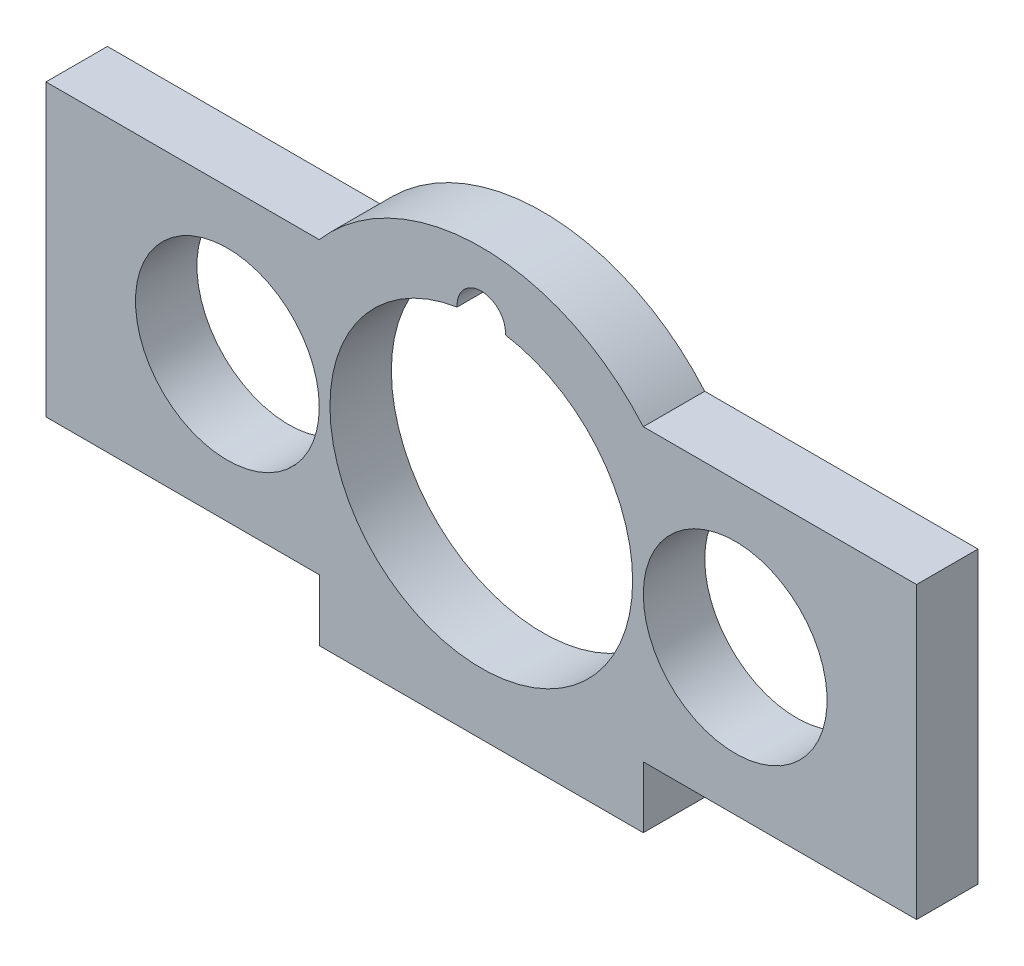
ISO-10303-21;
HEADER;
FILE_DESCRIPTION(('STEP AP214'),'2;1');
FILE_NAME('part.step','',(''),(''),'','','');
FILE_SCHEMA(('AUTOMOTIVE_DESIGN { 1 0 10303 214 1 1 1 1 }'));
ENDSEC;
DATA;
#1=APPLICATION_CONTEXT('core data for automotive mechanical design processes');
#2=APPLICATION_PROTOCOL_DEFINITION('international standard','automotive_design',2000,#1);
#3=PRODUCT_CONTEXT('',#1,'mechanical');
#4=PRODUCT('Part','Part','',(#3));
#5=PRODUCT_RELATED_PRODUCT_CATEGORY('part','',(#4));
#6=PRODUCT_DEFINITION_FORMATION('','',#4);
#7=PRODUCT_DEFINITION_CONTEXT('part definition',#1,'design');
#8=PRODUCT_DEFINITION('design','',#6,#7);
#9=PRODUCT_DEFINITION_SHAPE('','',#8);
#10=(LENGTH_UNIT() NAMED_UNIT(*) SI_UNIT(.MILLI.,.METRE.));
#11=(NAMED_UNIT(*) PLANE_ANGLE_UNIT() SI_UNIT($,.RADIAN.));
#12=(NAMED_UNIT(*) SI_UNIT($,.STERADIAN.) SOLID_ANGLE_UNIT());
#13=UNCERTAINTY_MEASURE_WITH_UNIT(LENGTH_MEASURE(1.E-05),#10,'distance_accuracy_value','');
#14=(GEOMETRIC_REPRESENTATION_CONTEXT(3) GLOBAL_UNCERTAINTY_ASSIGNED_CONTEXT((#13)) GLOBAL_UNIT_ASSIGNED_CONTEXT((#10,
#11,#12)) REPRESENTATION_CONTEXT('',''));
#15=CARTESIAN_POINT('',(0.,0.,0.));
#16=DIRECTION('',(0.,0.,1.));
#17=DIRECTION('',(1.,0.,0.));
#18=AXIS2_PLACEMENT_3D('',#15,#16,#17);
#19=CARTESIAN_POINT('',(0.,0.,2.54));
#20=DIRECTION('',(0.,0.,1.));
#21=DIRECTION('',(1.,0.,0.));
#22=AXIS2_PLACEMENT_3D('',#19,#20,#21);
#23=PLANE('',#22);
#24=CARTESIAN_POINT('',(0.,0.,2.54));
#25=DIRECTION('',(0.,0.,1.));
#26=DIRECTION('',(-1.,0.,0.));
#27=AXIS2_PLACEMENT_3D('',#24,#25,#26);
#28=CIRCLE('',#27,6.25856555906726);
#29=CARTESIAN_POINT('',(-0.997445717412066,6.17857142857143,2.54));
#30=VERTEX_POINT('',#29);
#31=CARTESIAN_POINT('',(0.997445717412068,6.17857142857143,2.54));
#32=VERTEX_POINT('',#31);
#33=EDGE_CURVE('E118',#30,#32,#28,.T.);
#34=ORIENTED_EDGE('',*,*,#33,.F.);
#35=CARTESIAN_POINT('',(0.,6.25,2.54));
#36=DIRECTION('',(0.,0.,1.));
#37=DIRECTION('',(1.,0.,0.));
#38=AXIS2_PLACEMENT_3D('',#35,#36,#37);
#39=CIRCLE('',#38,1.);
#40=EDGE_CURVE('E124',#32,#30,#39,.T.);
#41=ORIENTED_EDGE('',*,*,#40,.F.);
#42=EDGE_LOOP('',(#34,#41));
#43=FACE_BOUND('',#42,.T.);
#44=DIRECTION('',(1.,0.,0.));
#45=VECTOR('',#44,1.);
#46=CARTESIAN_POINT('',(-18.,-6.25856555906726,2.54));
#47=LINE('',#46,#45);
#48=CARTESIAN_POINT('',(-18.,-6.25856555906726,2.54));
#49=VERTEX_POINT('',#48);
#50=CARTESIAN_POINT('',(-6.69999999999999,-6.25856555906726,2.54));
#51=VERTEX_POINT('',#50);
#52=EDGE_CURVE('E146',#49,#51,#47,.T.);
#53=ORIENTED_EDGE('',*,*,#52,.T.);
#54=DIRECTION('',(0.,-1.,0.));
#55=VECTOR('',#54,1.);
#56=CARTESIAN_POINT('',(-6.69999999999999,-6.25856555906726,2.54));
#57=LINE('',#56,#55);
#58=CARTESIAN_POINT('',(-6.69999999999999,-8.79856555906726,2.54));
#59=VERTEX_POINT('',#58);
#60=EDGE_CURVE('E149',#51,#59,#57,.T.);
#61=ORIENTED_EDGE('',*,*,#60,.T.);
#62=DIRECTION('',(1.,0.,0.));
#63=VECTOR('',#62,1.);
#64=CARTESIAN_POINT('',(-6.69999999999999,-8.79856555906726,2.54));
#65=LINE('',#64,#63);
#66=CARTESIAN_POINT('',(6.69999999999999,-8.79856555906726,2.54));
#67=VERTEX_POINT('',#66);
#68=EDGE_CURVE('E152',#59,#67,#65,.T.);
#69=ORIENTED_EDGE('',*,*,#68,.T.);
#70=DIRECTION('',(0.,1.,0.));
#71=VECTOR('',#70,1.);
#72=CARTESIAN_POINT('',(6.69999999999999,-6.25856555906726,2.54));
#73=LINE('',#72,#71);
#74=CARTESIAN_POINT('',(6.69999999999999,-6.25856555906726,2.54));
#75=VERTEX_POINT('',#74);
#76=EDGE_CURVE('E154',#67,#75,#73,.T.);
#77=ORIENTED_EDGE('',*,*,#76,.T.);
#78=DIRECTION('',(1.,0.,0.));
#79=VECTOR('',#78,1.);
#80=CARTESIAN_POINT('',(18.,-6.25856555906726,2.54));
#81=LINE('',#80,#79);
#82=CARTESIAN_POINT('',(18.,-6.25856555906726,2.54));
#83=VERTEX_POINT('',#82);
#84=EDGE_CURVE('E156',#75,#83,#81,.T.);
#85=ORIENTED_EDGE('',*,*,#84,.T.);
#86=DIRECTION('',(0.,1.,0.));
#87=VECTOR('',#86,1.);
#88=CARTESIAN_POINT('',(18.,-6.25856555906726,2.54));
#89=LINE('',#88,#87);
#90=CARTESIAN_POINT('',(18.,5.74143444093274,2.54));
#91=VERTEX_POINT('',#90);
#92=EDGE_CURVE('E158',#83,#91,#89,.T.);
#93=ORIENTED_EDGE('',*,*,#92,.T.);
#94=DIRECTION('',(-1.,0.,0.));
#95=VECTOR('',#94,1.);
#96=CARTESIAN_POINT('',(18.,5.74143444093274,2.54));
#97=LINE('',#96,#95);
#98=CARTESIAN_POINT('',(6.69999999999999,5.74143444093274,2.54));
#99=VERTEX_POINT('',#98);
#100=EDGE_CURVE('E160',#91,#99,#97,.T.);
#101=ORIENTED_EDGE('',*,*,#100,.T.);
#102=CARTESIAN_POINT('',(0.,0.,2.54));
#103=DIRECTION('',(0.,0.,1.));
#104=DIRECTION('',(1.,0.,0.));
#105=AXIS2_PLACEMENT_3D('',#102,#103,#104);
#106=CIRCLE('',#105,8.82349530738973);
#107=CARTESIAN_POINT('',(-6.69999999999999,5.74143444093274,2.54));
#108=VERTEX_POINT('',#107);
#109=EDGE_CURVE('E162',#99,#108,#106,.T.);
#110=ORIENTED_EDGE('',*,*,#109,.T.);
#111=DIRECTION('',(-1.,0.,0.));
#112=VECTOR('',#111,1.);
#113=CARTESIAN_POINT('',(-18.,5.74143444093274,2.54));
#114=LINE('',#113,#112);
#115=CARTESIAN_POINT('',(-18.,5.74143444093274,2.54));
#116=VERTEX_POINT('',#115);
#117=EDGE_CURVE('E164',#108,#116,#114,.T.);
#118=ORIENTED_EDGE('',*,*,#117,.T.);
#119=DIRECTION('',(0.,-1.,0.));
#120=VECTOR('',#119,1.);
#121=CARTESIAN_POINT('',(-18.,-6.25856555906726,2.54));
#122=LINE('',#121,#120);
#123=EDGE_CURVE('E166',#116,#49,#122,.T.);
#124=ORIENTED_EDGE('',*,*,#123,.T.);
#125=EDGE_LOOP('',(#53,#61,#69,#77,#85,#93,#101,#110,#118,#124));
#126=FACE_BOUND('',#125,.T.);
#127=CARTESIAN_POINT('',(-10.5,-0.258565559067258,2.54));
#128=DIRECTION('',(0.,0.,1.));
#129=DIRECTION('',(1.,0.,0.));
#130=AXIS2_PLACEMENT_3D('',#127,#128,#129);
#131=CIRCLE('',#130,3.8);
#132=CARTESIAN_POINT('',(-6.7,-0.258565559067258,2.54));
#133=VERTEX_POINT('',#132);
#134=EDGE_CURVE('E140',#133,#133,#131,.T.);
#135=ORIENTED_EDGE('',*,*,#134,.F.);
#136=EDGE_LOOP('',(#135));
#137=FACE_BOUND('',#136,.T.);
#138=CARTESIAN_POINT('',(10.5,-0.258565559067259,2.54));
#139=DIRECTION('',(0.,0.,1.));
#140=DIRECTION('',(-1.,0.,0.));
#141=AXIS2_PLACEMENT_3D('',#138,#139,#140);
#142=CIRCLE('',#141,3.8);
#143=CARTESIAN_POINT('',(6.7,-0.258565559067259,2.54));
#144=VERTEX_POINT('',#143);
#145=EDGE_CURVE('E136',#144,#144,#142,.T.);
#146=ORIENTED_EDGE('',*,*,#145,.F.);
#147=EDGE_LOOP('',(#146));
#148=FACE_BOUND('',#147,.T.);
#149=ADVANCED_FACE('F30',(#43,#126,#137,#148),#23,.T.);
#150=CARTESIAN_POINT('',(0.,0.,0.));
#151=DIRECTION('',(0.,0.,1.));
#152=DIRECTION('',(1.,0.,0.));
#153=AXIS2_PLACEMENT_3D('',#150,#151,#152);
#154=PLANE('',#153);
#155=CARTESIAN_POINT('',(0.,6.25,0.));
#156=DIRECTION('',(0.,0.,1.));
#157=DIRECTION('',(1.,0.,0.));
#158=AXIS2_PLACEMENT_3D('',#155,#156,#157);
#159=CIRCLE('',#158,1.);
#160=CARTESIAN_POINT('',(0.997445717412068,6.17857142857143,0.));
#161=VERTEX_POINT('',#160);
#162=CARTESIAN_POINT('',(-0.997445717412066,6.17857142857143,0.));
#163=VERTEX_POINT('',#162);
#164=EDGE_CURVE('E52',#161,#163,#159,.T.);
#165=ORIENTED_EDGE('',*,*,#164,.T.);
#166=CARTESIAN_POINT('',(0.,0.,0.));
#167=DIRECTION('',(0.,0.,1.));
#168=DIRECTION('',(-1.,0.,0.));
#169=AXIS2_PLACEMENT_3D('',#166,#167,#168);
#170=CIRCLE('',#169,6.25856555906726);
#171=EDGE_CURVE('E129',#163,#161,#170,.T.);
#172=ORIENTED_EDGE('',*,*,#171,.T.);
#173=EDGE_LOOP('',(#165,#172));
#174=FACE_BOUND('',#173,.T.);
#175=DIRECTION('',(1.,0.,0.));
#176=VECTOR('',#175,1.);
#177=CARTESIAN_POINT('',(-18.,-6.25856555906726,0.));
#178=LINE('',#177,#176);
#179=CARTESIAN_POINT('',(-18.,-6.25856555906726,0.));
#180=VERTEX_POINT('',#179);
#181=CARTESIAN_POINT('',(-6.69999999999999,-6.25856555906726,0.));
#182=VERTEX_POINT('',#181);
#183=EDGE_CURVE('E143',#180,#182,#178,.T.);
#184=ORIENTED_EDGE('',*,*,#183,.F.);
#185=DIRECTION('',(0.,-1.,0.));
#186=VECTOR('',#185,1.);
#187=CARTESIAN_POINT('',(-18.,-6.25856555906726,0.));
#188=LINE('',#187,#186);
#189=CARTESIAN_POINT('',(-18.,5.74143444093274,0.));
#190=VERTEX_POINT('',#189);
#191=EDGE_CURVE('E150',#190,#180,#188,.T.);
#192=ORIENTED_EDGE('',*,*,#191,.F.);
#193=DIRECTION('',(-1.,0.,0.));
#194=VECTOR('',#193,1.);
#195=CARTESIAN_POINT('',(-18.,5.74143444093274,0.));
#196=LINE('',#195,#194);
#197=CARTESIAN_POINT('',(-6.69999999999999,5.74143444093274,0.));
#198=VERTEX_POINT('',#197);
#199=EDGE_CURVE('E185',#198,#190,#196,.T.);
#200=ORIENTED_EDGE('',*,*,#199,.F.);
#201=CARTESIAN_POINT('',(0.,0.,0.));
#202=DIRECTION('',(0.,0.,1.));
#203=DIRECTION('',(1.,0.,0.));
#204=AXIS2_PLACEMENT_3D('',#201,#202,#203);
#205=CIRCLE('',#204,8.82349530738973);
#206=CARTESIAN_POINT('',(6.69999999999999,5.74143444093274,0.));
#207=VERTEX_POINT('',#206);
#208=EDGE_CURVE('E183',#207,#198,#205,.T.);
#209=ORIENTED_EDGE('',*,*,#208,.F.);
#210=DIRECTION('',(-1.,0.,0.));
#211=VECTOR('',#210,1.);
#212=CARTESIAN_POINT('',(18.,5.74143444093274,0.));
#213=LINE('',#212,#211);
#214=CARTESIAN_POINT('',(18.,5.74143444093274,0.));
#215=VERTEX_POINT('',#214);
#216=EDGE_CURVE('E181',#215,#207,#213,.T.);
#217=ORIENTED_EDGE('',*,*,#216,.F.);
#218=DIRECTION('',(0.,1.,0.));
#219=VECTOR('',#218,1.);
#220=CARTESIAN_POINT('',(18.,-6.25856555906726,0.));
#221=LINE('',#220,#219);
#222=CARTESIAN_POINT('',(18.,-6.25856555906726,0.));
#223=VERTEX_POINT('',#222);
#224=EDGE_CURVE('E179',#223,#215,#221,.T.);
#225=ORIENTED_EDGE('',*,*,#224,.F.);
#226=DIRECTION('',(1.,0.,0.));
#227=VECTOR('',#226,1.);
#228=CARTESIAN_POINT('',(18.,-6.25856555906726,0.));
#229=LINE('',#228,#227);
#230=CARTESIAN_POINT('',(6.69999999999999,-6.25856555906726,0.));
#231=VERTEX_POINT('',#230);
#232=EDGE_CURVE('E177',#231,#223,#229,.T.);
#233=ORIENTED_EDGE('',*,*,#232,.F.);
#234=DIRECTION('',(0.,1.,0.));
#235=VECTOR('',#234,1.);
#236=CARTESIAN_POINT('',(6.69999999999999,-6.25856555906726,0.));
#237=LINE('',#236,#235);
#238=CARTESIAN_POINT('',(6.69999999999999,-8.79856555906726,0.));
#239=VERTEX_POINT('',#238);
#240=EDGE_CURVE('E175',#239,#231,#237,.T.);
#241=ORIENTED_EDGE('',*,*,#240,.F.);
#242=DIRECTION('',(1.,0.,0.));
#243=VECTOR('',#242,1.);
#244=CARTESIAN_POINT('',(-6.69999999999999,-8.79856555906726,0.));
#245=LINE('',#244,#243);
#246=CARTESIAN_POINT('',(-6.69999999999999,-8.79856555906726,0.));
#247=VERTEX_POINT('',#246);
#248=EDGE_CURVE('E173',#247,#239,#245,.T.);
#249=ORIENTED_EDGE('',*,*,#248,.F.);
#250=DIRECTION('',(0.,-1.,0.));
#251=VECTOR('',#250,1.);
#252=CARTESIAN_POINT('',(-6.69999999999999,-6.25856555906726,0.));
#253=LINE('',#252,#251);
#254=EDGE_CURVE('E171',#182,#247,#253,.T.);
#255=ORIENTED_EDGE('',*,*,#254,.F.);
#256=EDGE_LOOP('',(#184,#192,#200,#209,#217,#225,#233,#241,#249,#255));
#257=FACE_BOUND('',#256,.T.);
#258=CARTESIAN_POINT('',(-10.5,-0.258565559067258,0.));
#259=DIRECTION('',(0.,0.,1.));
#260=DIRECTION('',(1.,0.,0.));
#261=AXIS2_PLACEMENT_3D('',#258,#259,#260);
#262=CIRCLE('',#261,3.8);
#263=CARTESIAN_POINT('',(-6.7,-0.258565559067258,0.));
#264=VERTEX_POINT('',#263);
#265=EDGE_CURVE('E139',#264,#264,#262,.T.);
#266=ORIENTED_EDGE('',*,*,#265,.T.);
#267=EDGE_LOOP('',(#266));
#268=FACE_BOUND('',#267,.T.);
#269=CARTESIAN_POINT('',(10.5,-0.258565559067259,0.));
#270=DIRECTION('',(0.,0.,1.));
#271=DIRECTION('',(-1.,0.,0.));
#272=AXIS2_PLACEMENT_3D('',#269,#270,#271);
#273=CIRCLE('',#272,3.8);
#274=CARTESIAN_POINT('',(6.7,-0.258565559067259,0.));
#275=VERTEX_POINT('',#274);
#276=EDGE_CURVE('E133',#275,#275,#273,.T.);
#277=ORIENTED_EDGE('',*,*,#276,.T.);
#278=EDGE_LOOP('',(#277));
#279=FACE_BOUND('',#278,.T.);
#280=ADVANCED_FACE('F221',(#174,#257,#268,#279),#154,.F.);
#281=CARTESIAN_POINT('',(-18.,-6.25856555906726,2.54));
#282=DIRECTION('',(0.,1.,0.));
#283=DIRECTION('',(0.,0.,1.));
#284=AXIS2_PLACEMENT_3D('',#281,#282,#283);
#285=PLANE('',#284);
#286=ORIENTED_EDGE('',*,*,#183,.T.);
#287=DIRECTION('',(0.,0.,-1.));
#288=VECTOR('',#287,1.);
#289=CARTESIAN_POINT('',(-6.69999999999999,-6.25856555906726,2.54));
#290=LINE('',#289,#288);
#291=EDGE_CURVE('E11',#51,#182,#290,.T.);
#292=ORIENTED_EDGE('',*,*,#291,.F.);
#293=ORIENTED_EDGE('',*,*,#52,.F.);
#294=DIRECTION('',(0.,0.,-1.));
#295=VECTOR('',#294,1.);
#296=CARTESIAN_POINT('',(-18.,-6.25856555906726,2.54));
#297=LINE('',#296,#295);
#298=EDGE_CURVE('E168',#49,#180,#297,.T.);
#299=ORIENTED_EDGE('',*,*,#298,.T.);
#300=EDGE_LOOP('',(#286,#292,#293,#299));
#301=FACE_BOUND('',#300,.T.);
#302=ADVANCED_FACE('F32',(#301),#285,.F.);
#303=CARTESIAN_POINT('',(-6.69999999999999,-6.25856555906726,2.54));
#304=DIRECTION('',(1.,0.,0.));
#305=DIRECTION('',(0.,1.,0.));
#306=AXIS2_PLACEMENT_3D('',#303,#304,#305);
#307=PLANE('',#306);
#308=ORIENTED_EDGE('',*,*,#254,.T.);
#309=DIRECTION('',(0.,0.,-1.));
#310=VECTOR('',#309,1.);
#311=CARTESIAN_POINT('',(-6.69999999999999,-8.79856555906726,2.54));
#312=LINE('',#311,#310);
#313=EDGE_CURVE('E38',#59,#247,#312,.T.);
#314=ORIENTED_EDGE('',*,*,#313,.F.);
#315=ORIENTED_EDGE('',*,*,#60,.F.);
#316=ORIENTED_EDGE('',*,*,#291,.T.);
#317=EDGE_LOOP('',(#308,#314,#315,#316));
#318=FACE_BOUND('',#317,.T.);
#319=ADVANCED_FACE('F238',(#318),#307,.F.);
#320=CARTESIAN_POINT('',(-6.69999999999999,-8.79856555906726,2.54));
#321=DIRECTION('',(0.,1.,0.));
#322=DIRECTION('',(0.,0.,1.));
#323=AXIS2_PLACEMENT_3D('',#320,#321,#322);
#324=PLANE('',#323);
#325=ORIENTED_EDGE('',*,*,#248,.T.);
#326=DIRECTION('',(0.,0.,-1.));
#327=VECTOR('',#326,1.);
#328=CARTESIAN_POINT('',(6.69999999999999,-8.79856555906726,2.54));
#329=LINE('',#328,#327);
#330=EDGE_CURVE('E208',#67,#239,#329,.T.);
#331=ORIENTED_EDGE('',*,*,#330,.F.);
#332=ORIENTED_EDGE('',*,*,#68,.F.);
#333=ORIENTED_EDGE('',*,*,#313,.T.);
#334=EDGE_LOOP('',(#325,#331,#332,#333));
#335=FACE_BOUND('',#334,.T.);
#336=ADVANCED_FACE('F215',(#335),#324,.F.);
#337=CARTESIAN_POINT('',(6.69999999999999,-6.25856555906726,2.54));
#338=DIRECTION('',(-1.,0.,0.));
#339=DIRECTION('',(0.,-1.,0.));
#340=AXIS2_PLACEMENT_3D('',#337,#338,#339);
#341=PLANE('',#340);
#342=ORIENTED_EDGE('',*,*,#240,.T.);
#343=DIRECTION('',(0.,0.,-1.));
#344=VECTOR('',#343,1.);
#345=CARTESIAN_POINT('',(6.69999999999999,-6.25856555906726,2.54));
#346=LINE('',#345,#344);
#347=EDGE_CURVE('E205',#75,#231,#346,.T.);
#348=ORIENTED_EDGE('',*,*,#347,.F.);
#349=ORIENTED_EDGE('',*,*,#76,.F.);
#350=ORIENTED_EDGE('',*,*,#330,.T.);
#351=EDGE_LOOP('',(#342,#348,#349,#350));
#352=FACE_BOUND('',#351,.T.);
#353=ADVANCED_FACE('F227',(#352),#341,.F.);
#354=CARTESIAN_POINT('',(18.,-6.25856555906726,2.54));
#355=DIRECTION('',(0.,1.,0.));
#356=DIRECTION('',(0.,0.,1.));
#357=AXIS2_PLACEMENT_3D('',#354,#355,#356);
#358=PLANE('',#357);
#359=ORIENTED_EDGE('',*,*,#232,.T.);
#360=DIRECTION('',(0.,0.,-1.));
#361=VECTOR('',#360,1.);
#362=CARTESIAN_POINT('',(18.,-6.25856555906726,2.54));
#363=LINE('',#362,#361);
#364=EDGE_CURVE('E202',#83,#223,#363,.T.);
#365=ORIENTED_EDGE('',*,*,#364,.F.);
#366=ORIENTED_EDGE('',*,*,#84,.F.);
#367=ORIENTED_EDGE('',*,*,#347,.T.);
#368=EDGE_LOOP('',(#359,#365,#366,#367));
#369=FACE_BOUND('',#368,.T.);
#370=ADVANCED_FACE('F231',(#369),#358,.F.);
#371=CARTESIAN_POINT('',(18.,-6.25856555906726,2.54));
#372=DIRECTION('',(-1.,0.,0.));
#373=DIRECTION('',(0.,0.,1.));
#374=AXIS2_PLACEMENT_3D('',#371,#372,#373);
#375=PLANE('',#374);
#376=ORIENTED_EDGE('',*,*,#224,.T.);
#377=DIRECTION('',(0.,0.,-1.));
#378=VECTOR('',#377,1.);
#379=CARTESIAN_POINT('',(18.,5.74143444093274,2.54));
#380=LINE('',#379,#378);
#381=EDGE_CURVE('E199',#91,#215,#380,.T.);
#382=ORIENTED_EDGE('',*,*,#381,.F.);
#383=ORIENTED_EDGE('',*,*,#92,.F.);
#384=ORIENTED_EDGE('',*,*,#364,.T.);
#385=EDGE_LOOP('',(#376,#382,#383,#384));
#386=FACE_BOUND('',#385,.T.);
#387=ADVANCED_FACE('F261',(#386),#375,.F.);
#388=CARTESIAN_POINT('',(18.,5.74143444093274,2.54));
#389=DIRECTION('',(0.,-1.,0.));
#390=DIRECTION('',(0.,0.,-1.));
#391=AXIS2_PLACEMENT_3D('',#388,#389,#390);
#392=PLANE('',#391);
#393=ORIENTED_EDGE('',*,*,#216,.T.);
#394=DIRECTION('',(0.,0.,-1.));
#395=VECTOR('',#394,1.);
#396=CARTESIAN_POINT('',(6.69999999999999,5.74143444093274,2.54));
#397=LINE('',#396,#395);
#398=EDGE_CURVE('E196',#99,#207,#397,.T.);
#399=ORIENTED_EDGE('',*,*,#398,.F.);
#400=ORIENTED_EDGE('',*,*,#100,.F.);
#401=ORIENTED_EDGE('',*,*,#381,.T.);
#402=EDGE_LOOP('',(#393,#399,#400,#401));
#403=FACE_BOUND('',#402,.T.);
#404=ADVANCED_FACE('F258',(#403),#392,.F.);
#405=CARTESIAN_POINT('',(0.,0.,2.54));
#406=DIRECTION('',(0.,0.,-1.));
#407=DIRECTION('',(-1.,0.,0.));
#408=AXIS2_PLACEMENT_3D('',#405,#406,#407);
#409=CYLINDRICAL_SURFACE('',#408,8.82349530738973);
#410=ORIENTED_EDGE('',*,*,#208,.T.);
#411=DIRECTION('',(0.,0.,-1.));
#412=VECTOR('',#411,1.);
#413=CARTESIAN_POINT('',(-6.69999999999999,5.74143444093274,2.54));
#414=LINE('',#413,#412);
#415=EDGE_CURVE('E193',#108,#198,#414,.T.);
#416=ORIENTED_EDGE('',*,*,#415,.F.);
#417=ORIENTED_EDGE('',*,*,#109,.F.);
#418=ORIENTED_EDGE('',*,*,#398,.T.);
#419=EDGE_LOOP('',(#410,#416,#417,#418));
#420=FACE_BOUND('',#419,.T.);
#421=ADVANCED_FACE('F254',(#420),#409,.T.);
#422=CARTESIAN_POINT('',(-18.,5.74143444093274,2.54));
#423=DIRECTION('',(0.,-1.,0.));
#424=DIRECTION('',(1.,0.,0.));
#425=AXIS2_PLACEMENT_3D('',#422,#423,#424);
#426=PLANE('',#425);
#427=ORIENTED_EDGE('',*,*,#199,.T.);
#428=DIRECTION('',(0.,0.,-1.));
#429=VECTOR('',#428,1.);
#430=CARTESIAN_POINT('',(-18.,5.74143444093274,2.54));
#431=LINE('',#430,#429);
#432=EDGE_CURVE('E190',#116,#190,#431,.T.);
#433=ORIENTED_EDGE('',*,*,#432,.F.);
#434=ORIENTED_EDGE('',*,*,#117,.F.);
#435=ORIENTED_EDGE('',*,*,#415,.T.);
#436=EDGE_LOOP('',(#427,#433,#434,#435));
#437=FACE_BOUND('',#436,.T.);
#438=ADVANCED_FACE('F250',(#437),#426,.F.);
#439=CARTESIAN_POINT('',(-18.,-6.25856555906726,2.54));
#440=DIRECTION('',(1.,0.,0.));
#441=DIRECTION('',(0.,0.,-1.));
#442=AXIS2_PLACEMENT_3D('',#439,#440,#441);
#443=PLANE('',#442);
#444=ORIENTED_EDGE('',*,*,#191,.T.);
#445=ORIENTED_EDGE('',*,*,#298,.F.);
#446=ORIENTED_EDGE('',*,*,#123,.F.);
#447=ORIENTED_EDGE('',*,*,#432,.T.);
#448=EDGE_LOOP('',(#444,#445,#446,#447));
#449=FACE_BOUND('',#448,.T.);
#450=ADVANCED_FACE('F245',(#449),#443,.F.);
#451=CARTESIAN_POINT('',(-10.5,-0.258565559067258,2.54));
#452=DIRECTION('',(0.,0.,-1.));
#453=DIRECTION('',(-1.,0.,0.));
#454=AXIS2_PLACEMENT_3D('',#451,#452,#453);
#455=CYLINDRICAL_SURFACE('',#454,3.8);
#456=ORIENTED_EDGE('',*,*,#134,.T.);
#457=EDGE_LOOP('',(#456));
#458=FACE_BOUND('',#457,.T.);
#459=ORIENTED_EDGE('',*,*,#265,.F.);
#460=EDGE_LOOP('',(#459));
#461=FACE_BOUND('',#460,.T.);
#462=ADVANCED_FACE('F278',(#458,#461),#455,.F.);
#463=CARTESIAN_POINT('',(0.,6.25,2.54));
#464=DIRECTION('',(0.,0.,-1.));
#465=DIRECTION('',(-1.,0.,0.));
#466=AXIS2_PLACEMENT_3D('',#463,#464,#465);
#467=CYLINDRICAL_SURFACE('',#466,1.);
#468=ORIENTED_EDGE('',*,*,#164,.F.);
#469=DIRECTION('',(0.,0.,-1.));
#470=VECTOR('',#469,1.);
#471=CARTESIAN_POINT('',(0.997445717412068,6.17857142857143,2.54));
#472=LINE('',#471,#470);
#473=EDGE_CURVE('E120',#32,#161,#472,.T.);
#474=ORIENTED_EDGE('',*,*,#473,.F.);
#475=ORIENTED_EDGE('',*,*,#40,.T.);
#476=DIRECTION('',(0.,0.,-1.));
#477=VECTOR('',#476,1.);
#478=CARTESIAN_POINT('',(-0.997445717412066,6.17857142857143,2.54));
#479=LINE('',#478,#477);
#480=EDGE_CURVE('E45',#30,#163,#479,.T.);
#481=ORIENTED_EDGE('',*,*,#480,.T.);
#482=EDGE_LOOP('',(#468,#474,#475,#481));
#483=FACE_BOUND('',#482,.T.);
#484=ADVANCED_FACE('F126',(#483),#467,.F.);
#485=CARTESIAN_POINT('',(0.,0.,2.54));
#486=DIRECTION('',(0.,0.,-1.));
#487=DIRECTION('',(-1.,0.,0.));
#488=AXIS2_PLACEMENT_3D('',#485,#486,#487);
#489=CYLINDRICAL_SURFACE('',#488,6.25856555906726);
#490=ORIENTED_EDGE('',*,*,#171,.F.);
#491=ORIENTED_EDGE('',*,*,#480,.F.);
#492=ORIENTED_EDGE('',*,*,#33,.T.);
#493=ORIENTED_EDGE('',*,*,#473,.T.);
#494=EDGE_LOOP('',(#490,#491,#492,#493));
#495=FACE_BOUND('',#494,.T.);
#496=ADVANCED_FACE('F119',(#495),#489,.F.);
#497=CARTESIAN_POINT('',(10.5,-0.258565559067259,2.54));
#498=DIRECTION('',(0.,0.,-1.));
#499=DIRECTION('',(-1.,0.,0.));
#500=AXIS2_PLACEMENT_3D('',#497,#498,#499);
#501=CYLINDRICAL_SURFACE('',#500,3.8);
#502=ORIENTED_EDGE('',*,*,#145,.T.);
#503=EDGE_LOOP('',(#502));
#504=FACE_BOUND('',#503,.T.);
#505=ORIENTED_EDGE('',*,*,#276,.F.);
#506=EDGE_LOOP('',(#505));
#507=FACE_BOUND('',#506,.T.);
#508=ADVANCED_FACE('F315',(#504,#507),#501,.F.);
#509=CLOSED_SHELL('',(#149,#280,#302,#319,#336,#353,#370,#387,#404,#421,#438,#450,#462,#484,
#496,#508));
#510=MANIFOLD_SOLID_BREP('B2',#509);
#511=ADVANCED_BREP_SHAPE_REPRESENTATION('',(#18,#510),#14);
#512=SHAPE_DEFINITION_REPRESENTATION(#9,#511);
ENDSEC;
END-ISO-10303-21;
